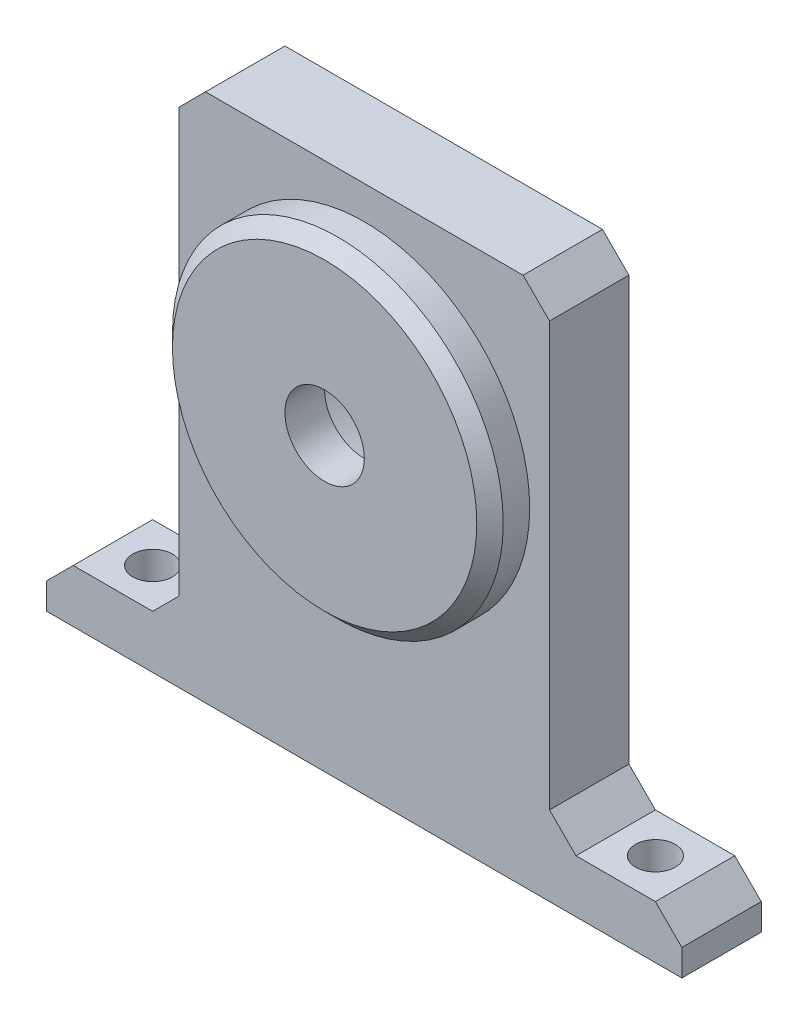
ISO-10303-21;
HEADER;
FILE_DESCRIPTION(('STEP AP214'),'2;1');
FILE_NAME('part.step','',(''),(''),'','','');
FILE_SCHEMA(('AUTOMOTIVE_DESIGN { 1 0 10303 214 1 1 1 1 }'));
ENDSEC;
DATA;
#1=APPLICATION_CONTEXT('core data for automotive mechanical design processes');
#2=APPLICATION_PROTOCOL_DEFINITION('international standard','automotive_design',2000,#1);
#3=PRODUCT_CONTEXT('',#1,'mechanical');
#4=PRODUCT('Part','Part','',(#3));
#5=PRODUCT_RELATED_PRODUCT_CATEGORY('part','',(#4));
#6=PRODUCT_DEFINITION_FORMATION('','',#4);
#7=PRODUCT_DEFINITION_CONTEXT('part definition',#1,'design');
#8=PRODUCT_DEFINITION('design','',#6,#7);
#9=PRODUCT_DEFINITION_SHAPE('','',#8);
#10=(LENGTH_UNIT() NAMED_UNIT(*) SI_UNIT(.MILLI.,.METRE.));
#11=(NAMED_UNIT(*) PLANE_ANGLE_UNIT() SI_UNIT($,.RADIAN.));
#12=(NAMED_UNIT(*) SI_UNIT($,.STERADIAN.) SOLID_ANGLE_UNIT());
#13=UNCERTAINTY_MEASURE_WITH_UNIT(LENGTH_MEASURE(1.E-05),#10,'distance_accuracy_value','');
#14=(GEOMETRIC_REPRESENTATION_CONTEXT(3) GLOBAL_UNCERTAINTY_ASSIGNED_CONTEXT((#13)) GLOBAL_UNIT_ASSIGNED_CONTEXT((#10,
#11,#12)) REPRESENTATION_CONTEXT('',''));
#15=CARTESIAN_POINT('',(0.,0.,0.));
#16=DIRECTION('',(0.,0.,1.));
#17=DIRECTION('',(1.,0.,0.));
#18=AXIS2_PLACEMENT_3D('',#15,#16,#17);
#19=CARTESIAN_POINT('',(0.,0.,6.));
#20=DIRECTION('',(1.,0.,0.));
#21=DIRECTION('',(0.,0.,-1.));
#22=AXIS2_PLACEMENT_3D('',#19,#20,#21);
#23=PLANE('',#22);
#24=DIRECTION('',(0.,-1.,0.));
#25=VECTOR('',#24,1.);
#26=CARTESIAN_POINT('',(0.,0.,0.));
#27=LINE('',#26,#25);
#28=CARTESIAN_POINT('',(0.,38.,0.));
#29=VERTEX_POINT('',#28);
#30=CARTESIAN_POINT('',(0.,5.99999999999999,0.));
#31=VERTEX_POINT('',#30);
#32=EDGE_CURVE('E177',#29,#31,#27,.T.);
#33=ORIENTED_EDGE('',*,*,#32,.T.);
#34=DIRECTION('',(0.,0.,1.));
#35=VECTOR('',#34,1.);
#36=CARTESIAN_POINT('',(0.,5.99999999999999,6.));
#37=LINE('',#36,#35);
#38=CARTESIAN_POINT('',(0.,5.99999999999999,6.));
#39=VERTEX_POINT('',#38);
#40=EDGE_CURVE('E296',#31,#39,#37,.T.);
#41=ORIENTED_EDGE('',*,*,#40,.T.);
#42=DIRECTION('',(0.,-1.,0.));
#43=VECTOR('',#42,1.);
#44=CARTESIAN_POINT('',(0.,0.,6.));
#45=LINE('',#44,#43);
#46=CARTESIAN_POINT('',(0.,38.,6.));
#47=VERTEX_POINT('',#46);
#48=EDGE_CURVE('E222',#47,#39,#45,.T.);
#49=ORIENTED_EDGE('',*,*,#48,.F.);
#50=DIRECTION('',(0.,0.,-1.));
#51=VECTOR('',#50,1.);
#52=CARTESIAN_POINT('',(0.,38.,6.));
#53=LINE('',#52,#51);
#54=EDGE_CURVE('E295',#47,#29,#53,.T.);
#55=ORIENTED_EDGE('',*,*,#54,.T.);
#56=EDGE_LOOP('',(#33,#41,#49,#55));
#57=FACE_BOUND('',#56,.T.);
#58=ADVANCED_FACE('F50',(#57),#23,.F.);
#59=CARTESIAN_POINT('',(28.,0.,6.));
#60=DIRECTION('',(-1.,0.,0.));
#61=DIRECTION('',(0.,0.,1.));
#62=AXIS2_PLACEMENT_3D('',#59,#60,#61);
#63=PLANE('',#62);
#64=DIRECTION('',(0.,1.,0.));
#65=VECTOR('',#64,1.);
#66=CARTESIAN_POINT('',(28.,0.,6.));
#67=LINE('',#66,#65);
#68=CARTESIAN_POINT('',(28.,5.99999999999999,6.));
#69=VERTEX_POINT('',#68);
#70=CARTESIAN_POINT('',(28.,38.,6.));
#71=VERTEX_POINT('',#70);
#72=EDGE_CURVE('E227',#69,#71,#67,.T.);
#73=ORIENTED_EDGE('',*,*,#72,.F.);
#74=DIRECTION('',(0.,0.,-1.));
#75=VECTOR('',#74,1.);
#76=CARTESIAN_POINT('',(28.,5.99999999999999,6.));
#77=LINE('',#76,#75);
#78=CARTESIAN_POINT('',(28.,5.99999999999999,0.));
#79=VERTEX_POINT('',#78);
#80=EDGE_CURVE('E251',#69,#79,#77,.T.);
#81=ORIENTED_EDGE('',*,*,#80,.T.);
#82=DIRECTION('',(0.,1.,0.));
#83=VECTOR('',#82,1.);
#84=CARTESIAN_POINT('',(28.,0.,0.));
#85=LINE('',#84,#83);
#86=CARTESIAN_POINT('',(28.,38.,0.));
#87=VERTEX_POINT('',#86);
#88=EDGE_CURVE('E179',#79,#87,#85,.T.);
#89=ORIENTED_EDGE('',*,*,#88,.T.);
#90=DIRECTION('',(0.,0.,1.));
#91=VECTOR('',#90,1.);
#92=CARTESIAN_POINT('',(28.,38.,6.));
#93=LINE('',#92,#91);
#94=EDGE_CURVE('E246',#87,#71,#93,.T.);
#95=ORIENTED_EDGE('',*,*,#94,.T.);
#96=EDGE_LOOP('',(#73,#81,#89,#95));
#97=FACE_BOUND('',#96,.T.);
#98=ADVANCED_FACE('F367',(#97),#63,.F.);
#99=CARTESIAN_POINT('',(0.,0.,6.));
#100=DIRECTION('',(0.,0.,-1.));
#101=DIRECTION('',(-1.,0.,0.));
#102=AXIS2_PLACEMENT_3D('',#99,#100,#101);
#103=PLANE('',#102);
#104=CARTESIAN_POINT('',(14.,25.,6.));
#105=DIRECTION('',(0.,0.,1.));
#106=DIRECTION('',(1.,0.,0.));
#107=AXIS2_PLACEMENT_3D('',#104,#105,#106);
#108=CIRCLE('',#107,12.5);
#109=CARTESIAN_POINT('',(26.5,25.,6.));
#110=VERTEX_POINT('',#109);
#111=EDGE_CURVE('E316',#110,#110,#108,.T.);
#112=ORIENTED_EDGE('',*,*,#111,.F.);
#113=EDGE_LOOP('',(#112));
#114=FACE_BOUND('',#113,.T.);
#115=DIRECTION('',(0.,-1.,0.));
#116=VECTOR('',#115,1.);
#117=CARTESIAN_POINT('',(38.,4.,6.));
#118=LINE('',#117,#116);
#119=CARTESIAN_POINT('',(38.,1.99999999999999,6.));
#120=VERTEX_POINT('',#119);
#121=CARTESIAN_POINT('',(38.,0.,6.));
#122=VERTEX_POINT('',#121);
#123=EDGE_CURVE('E200',#120,#122,#118,.T.);
#124=ORIENTED_EDGE('',*,*,#123,.F.);
#125=DIRECTION('',(-0.707106781186546,0.707106781186549,0.));
#126=VECTOR('',#125,1.);
#127=CARTESIAN_POINT('',(36.,4.,6.));
#128=LINE('',#127,#126);
#129=CARTESIAN_POINT('',(36.,4.,6.));
#130=VERTEX_POINT('',#129);
#131=EDGE_CURVE('E276',#120,#130,#128,.T.);
#132=ORIENTED_EDGE('',*,*,#131,.T.);
#133=DIRECTION('',(1.,0.,0.));
#134=VECTOR('',#133,1.);
#135=CARTESIAN_POINT('',(28.,4.,6.));
#136=LINE('',#135,#134);
#137=CARTESIAN_POINT('',(30.,4.,6.));
#138=VERTEX_POINT('',#137);
#139=EDGE_CURVE('E192',#138,#130,#136,.T.);
#140=ORIENTED_EDGE('',*,*,#139,.F.);
#141=DIRECTION('',(-0.707106781186552,0.707106781186543,0.));
#142=VECTOR('',#141,1.);
#143=CARTESIAN_POINT('',(16.9999999999998,17.,6.));
#144=LINE('',#143,#142);
#145=EDGE_CURVE('E301',#138,#69,#144,.T.);
#146=ORIENTED_EDGE('',*,*,#145,.T.);
#147=ORIENTED_EDGE('',*,*,#72,.T.);
#148=DIRECTION('',(0.707106781186546,-0.707106781186549,0.));
#149=VECTOR('',#148,1.);
#150=CARTESIAN_POINT('',(26.,40.,6.));
#151=LINE('',#150,#149);
#152=CARTESIAN_POINT('',(26.,40.,6.));
#153=VERTEX_POINT('',#152);
#154=EDGE_CURVE('E72',#71,#153,#151,.F.);
#155=ORIENTED_EDGE('',*,*,#154,.T.);
#156=DIRECTION('',(-1.,0.,0.));
#157=VECTOR('',#156,1.);
#158=CARTESIAN_POINT('',(0.,40.,6.));
#159=LINE('',#158,#157);
#160=CARTESIAN_POINT('',(2.00000000000001,40.,6.));
#161=VERTEX_POINT('',#160);
#162=EDGE_CURVE('E233',#153,#161,#159,.T.);
#163=ORIENTED_EDGE('',*,*,#162,.T.);
#164=DIRECTION('',(0.707106781186549,0.707106781186546,0.));
#165=VECTOR('',#164,1.);
#166=CARTESIAN_POINT('',(0.,38.,6.));
#167=LINE('',#166,#165);
#168=EDGE_CURVE('E272',#161,#47,#167,.F.);
#169=ORIENTED_EDGE('',*,*,#168,.T.);
#170=ORIENTED_EDGE('',*,*,#48,.T.);
#171=DIRECTION('',(0.707106781186552,0.707106781186543,0.));
#172=VECTOR('',#171,1.);
#173=CARTESIAN_POINT('',(-2.99999999999999,3.00000000000004,6.));
#174=LINE('',#173,#172);
#175=CARTESIAN_POINT('',(-2.00000000000002,4.,6.));
#176=VERTEX_POINT('',#175);
#177=EDGE_CURVE('E314',#39,#176,#174,.F.);
#178=ORIENTED_EDGE('',*,*,#177,.T.);
#179=DIRECTION('',(1.,0.,0.));
#180=VECTOR('',#179,1.);
#181=CARTESIAN_POINT('',(0.,4.,6.));
#182=LINE('',#181,#180);
#183=CARTESIAN_POINT('',(-8.00000000000001,4.,6.));
#184=VERTEX_POINT('',#183);
#185=EDGE_CURVE('E193',#184,#176,#182,.T.);
#186=ORIENTED_EDGE('',*,*,#185,.F.);
#187=DIRECTION('',(0.707106781186546,0.707106781186549,0.));
#188=VECTOR('',#187,1.);
#189=CARTESIAN_POINT('',(-8.00000000000001,4.,6.));
#190=LINE('',#189,#188);
#191=CARTESIAN_POINT('',(-10.,2.,6.));
#192=VERTEX_POINT('',#191);
#193=EDGE_CURVE('E277',#184,#192,#190,.F.);
#194=ORIENTED_EDGE('',*,*,#193,.T.);
#195=DIRECTION('',(0.,-1.,0.));
#196=VECTOR('',#195,1.);
#197=CARTESIAN_POINT('',(-10.,4.,6.));
#198=LINE('',#197,#196);
#199=CARTESIAN_POINT('',(-10.,0.,6.));
#200=VERTEX_POINT('',#199);
#201=EDGE_CURVE('E163',#192,#200,#198,.T.);
#202=ORIENTED_EDGE('',*,*,#201,.T.);
#203=DIRECTION('',(1.,0.,0.));
#204=VECTOR('',#203,1.);
#205=CARTESIAN_POINT('',(0.,0.,6.));
#206=LINE('',#205,#204);
#207=EDGE_CURVE('E181',#200,#122,#206,.T.);
#208=ORIENTED_EDGE('',*,*,#207,.T.);
#209=EDGE_LOOP('',(#124,#132,#140,#146,#147,#155,#163,#169,#170,#178,#186,#194,#202,#208));
#210=FACE_BOUND('',#209,.T.);
#211=ADVANCED_FACE('F366',(#114,#210),#103,.F.);
#212=CARTESIAN_POINT('',(0.,0.,0.));
#213=DIRECTION('',(0.,0.,-1.));
#214=DIRECTION('',(-1.,0.,0.));
#215=AXIS2_PLACEMENT_3D('',#212,#213,#214);
#216=PLANE('',#215);
#217=DIRECTION('',(-1.,0.,0.));
#218=VECTOR('',#217,1.);
#219=CARTESIAN_POINT('',(28.,4.,0.));
#220=LINE('',#219,#218);
#221=CARTESIAN_POINT('',(36.,4.,0.));
#222=VERTEX_POINT('',#221);
#223=CARTESIAN_POINT('',(30.,4.,0.));
#224=VERTEX_POINT('',#223);
#225=EDGE_CURVE('E204',#222,#224,#220,.T.);
#226=ORIENTED_EDGE('',*,*,#225,.F.);
#227=DIRECTION('',(0.707106781186546,-0.707106781186549,0.));
#228=VECTOR('',#227,1.);
#229=CARTESIAN_POINT('',(20.0000000000001,20.,0.));
#230=LINE('',#229,#228);
#231=CARTESIAN_POINT('',(38.,1.99999999999999,0.));
#232=VERTEX_POINT('',#231);
#233=EDGE_CURVE('E264',#222,#232,#230,.T.);
#234=ORIENTED_EDGE('',*,*,#233,.T.);
#235=DIRECTION('',(0.,-1.,0.));
#236=VECTOR('',#235,1.);
#237=CARTESIAN_POINT('',(38.,4.,0.));
#238=LINE('',#237,#236);
#239=CARTESIAN_POINT('',(38.,0.,0.));
#240=VERTEX_POINT('',#239);
#241=EDGE_CURVE('E175',#232,#240,#238,.T.);
#242=ORIENTED_EDGE('',*,*,#241,.T.);
#243=DIRECTION('',(1.,0.,0.));
#244=VECTOR('',#243,1.);
#245=CARTESIAN_POINT('',(0.,0.,0.));
#246=LINE('',#245,#244);
#247=CARTESIAN_POINT('',(-10.,0.,0.));
#248=VERTEX_POINT('',#247);
#249=EDGE_CURVE('E170',#248,#240,#246,.T.);
#250=ORIENTED_EDGE('',*,*,#249,.F.);
#251=DIRECTION('',(0.,-1.,0.));
#252=VECTOR('',#251,1.);
#253=CARTESIAN_POINT('',(-10.,4.,0.));
#254=LINE('',#253,#252);
#255=CARTESIAN_POINT('',(-10.,2.,0.));
#256=VERTEX_POINT('',#255);
#257=EDGE_CURVE('E155',#256,#248,#254,.T.);
#258=ORIENTED_EDGE('',*,*,#257,.F.);
#259=DIRECTION('',(-0.707106781186546,-0.707106781186549,0.));
#260=VECTOR('',#259,1.);
#261=CARTESIAN_POINT('',(-6.00000000000002,5.99999999999999,0.));
#262=LINE('',#261,#260);
#263=CARTESIAN_POINT('',(-8.,4.,0.));
#264=VERTEX_POINT('',#263);
#265=EDGE_CURVE('E265',#256,#264,#262,.F.);
#266=ORIENTED_EDGE('',*,*,#265,.T.);
#267=DIRECTION('',(-1.,0.,0.));
#268=VECTOR('',#267,1.);
#269=CARTESIAN_POINT('',(0.,4.,0.));
#270=LINE('',#269,#268);
#271=CARTESIAN_POINT('',(-2.00000000000002,4.,0.));
#272=VERTEX_POINT('',#271);
#273=EDGE_CURVE('E183',#272,#264,#270,.T.);
#274=ORIENTED_EDGE('',*,*,#273,.F.);
#275=DIRECTION('',(-0.707106781186552,-0.707106781186543,0.));
#276=VECTOR('',#275,1.);
#277=CARTESIAN_POINT('',(-2.00000000000002,4.,0.));
#278=LINE('',#277,#276);
#279=EDGE_CURVE('E313',#272,#31,#278,.F.);
#280=ORIENTED_EDGE('',*,*,#279,.T.);
#281=ORIENTED_EDGE('',*,*,#32,.F.);
#282=DIRECTION('',(-0.707106781186549,-0.707106781186546,0.));
#283=VECTOR('',#282,1.);
#284=CARTESIAN_POINT('',(-19.,19.0000000000001,0.));
#285=LINE('',#284,#283);
#286=CARTESIAN_POINT('',(2.00000000000001,40.,0.));
#287=VERTEX_POINT('',#286);
#288=EDGE_CURVE('E259',#29,#287,#285,.F.);
#289=ORIENTED_EDGE('',*,*,#288,.T.);
#290=DIRECTION('',(-1.,0.,0.));
#291=VECTOR('',#290,1.);
#292=CARTESIAN_POINT('',(0.,40.,0.));
#293=LINE('',#292,#291);
#294=CARTESIAN_POINT('',(26.,40.,0.));
#295=VERTEX_POINT('',#294);
#296=EDGE_CURVE('E223',#295,#287,#293,.T.);
#297=ORIENTED_EDGE('',*,*,#296,.F.);
#298=DIRECTION('',(-0.707106781186546,0.707106781186549,0.));
#299=VECTOR('',#298,1.);
#300=CARTESIAN_POINT('',(33.,32.9999999999999,0.));
#301=LINE('',#300,#299);
#302=EDGE_CURVE('E258',#295,#87,#301,.F.);
#303=ORIENTED_EDGE('',*,*,#302,.T.);
#304=ORIENTED_EDGE('',*,*,#88,.F.);
#305=DIRECTION('',(0.707106781186552,-0.707106781186543,0.));
#306=VECTOR('',#305,1.);
#307=CARTESIAN_POINT('',(30.,4.,0.));
#308=LINE('',#307,#306);
#309=EDGE_CURVE('E306',#79,#224,#308,.T.);
#310=ORIENTED_EDGE('',*,*,#309,.T.);
#311=EDGE_LOOP('',(#226,#234,#242,#250,#258,#266,#274,#280,#281,#289,#297,#303,#304,#310));
#312=FACE_BOUND('',#311,.T.);
#313=CARTESIAN_POINT('',(14.,25.,0.));
#314=DIRECTION('',(0.,0.,1.));
#315=DIRECTION('',(1.,0.,0.));
#316=AXIS2_PLACEMENT_3D('',#313,#314,#315);
#317=CIRCLE('',#316,9.5);
#318=CARTESIAN_POINT('',(23.5,25.,0.));
#319=VERTEX_POINT('',#318);
#320=EDGE_CURVE('E162',#319,#319,#317,.T.);
#321=ORIENTED_EDGE('',*,*,#320,.T.);
#322=EDGE_LOOP('',(#321));
#323=FACE_BOUND('',#322,.T.);
#324=ADVANCED_FACE('F166',(#312,#323),#216,.T.);
#325=CARTESIAN_POINT('',(0.,0.,6.));
#326=DIRECTION('',(0.,1.,0.));
#327=DIRECTION('',(0.,0.,1.));
#328=AXIS2_PLACEMENT_3D('',#325,#326,#327);
#329=PLANE('',#328);
#330=CARTESIAN_POINT('',(-5.00000000000001,0.,3.00000000000001));
#331=DIRECTION('',(0.,1.,0.));
#332=DIRECTION('',(0.,0.,1.));
#333=AXIS2_PLACEMENT_3D('',#330,#331,#332);
#334=CIRCLE('',#333,1.5);
#335=CARTESIAN_POINT('',(-5.00000000000001,0.,4.50000000000001));
#336=VERTEX_POINT('',#335);
#337=EDGE_CURVE('E205',#336,#336,#334,.T.);
#338=ORIENTED_EDGE('',*,*,#337,.T.);
#339=EDGE_LOOP('',(#338));
#340=FACE_BOUND('',#339,.T.);
#341=CARTESIAN_POINT('',(33.,0.,3.00000000000001));
#342=DIRECTION('',(0.,1.,0.));
#343=DIRECTION('',(0.,0.,1.));
#344=AXIS2_PLACEMENT_3D('',#341,#342,#343);
#345=CIRCLE('',#344,1.5);
#346=CARTESIAN_POINT('',(33.,0.,4.50000000000001));
#347=VERTEX_POINT('',#346);
#348=EDGE_CURVE('E216',#347,#347,#345,.T.);
#349=ORIENTED_EDGE('',*,*,#348,.T.);
#350=EDGE_LOOP('',(#349));
#351=FACE_BOUND('',#350,.T.);
#352=ORIENTED_EDGE('',*,*,#249,.T.);
#353=DIRECTION('',(0.,0.,-1.));
#354=VECTOR('',#353,1.);
#355=CARTESIAN_POINT('',(38.,0.,0.));
#356=LINE('',#355,#354);
#357=EDGE_CURVE('E186',#122,#240,#356,.T.);
#358=ORIENTED_EDGE('',*,*,#357,.F.);
#359=ORIENTED_EDGE('',*,*,#207,.F.);
#360=DIRECTION('',(0.,0.,1.));
#361=VECTOR('',#360,1.);
#362=CARTESIAN_POINT('',(-10.,0.,0.));
#363=LINE('',#362,#361);
#364=EDGE_CURVE('E160',#248,#200,#363,.T.);
#365=ORIENTED_EDGE('',*,*,#364,.F.);
#366=EDGE_LOOP('',(#352,#358,#359,#365));
#367=FACE_BOUND('',#366,.T.);
#368=ADVANCED_FACE('F182',(#340,#351,#367),#329,.F.);
#369=CARTESIAN_POINT('',(0.,40.,6.));
#370=DIRECTION('',(0.,-1.,0.));
#371=DIRECTION('',(0.,0.,-1.));
#372=AXIS2_PLACEMENT_3D('',#369,#370,#371);
#373=PLANE('',#372);
#374=ORIENTED_EDGE('',*,*,#296,.T.);
#375=DIRECTION('',(0.,0.,1.));
#376=VECTOR('',#375,1.);
#377=CARTESIAN_POINT('',(2.00000000000001,40.,6.));
#378=LINE('',#377,#376);
#379=EDGE_CURVE('E63',#287,#161,#378,.T.);
#380=ORIENTED_EDGE('',*,*,#379,.T.);
#381=ORIENTED_EDGE('',*,*,#162,.F.);
#382=DIRECTION('',(0.,0.,-1.));
#383=VECTOR('',#382,1.);
#384=CARTESIAN_POINT('',(26.,40.,6.));
#385=LINE('',#384,#383);
#386=EDGE_CURVE('E298',#153,#295,#385,.T.);
#387=ORIENTED_EDGE('',*,*,#386,.T.);
#388=EDGE_LOOP('',(#374,#380,#381,#387));
#389=FACE_BOUND('',#388,.T.);
#390=ADVANCED_FACE('F380',(#389),#373,.F.);
#391=CARTESIAN_POINT('',(14.,25.,6.));
#392=DIRECTION('',(0.,0.,-1.));
#393=DIRECTION('',(-1.,0.,0.));
#394=AXIS2_PLACEMENT_3D('',#391,#392,#393);
#395=CYLINDRICAL_SURFACE('',#394,9.5);
#396=CARTESIAN_POINT('',(14.,25.,6.));
#397=DIRECTION('',(0.,0.,1.));
#398=DIRECTION('',(1.,0.,0.));
#399=AXIS2_PLACEMENT_3D('',#396,#397,#398);
#400=CIRCLE('',#399,9.5);
#401=CARTESIAN_POINT('',(23.5,25.,6.));
#402=VERTEX_POINT('',#401);
#403=EDGE_CURVE('E215',#402,#402,#400,.T.);
#404=ORIENTED_EDGE('',*,*,#403,.T.);
#405=EDGE_LOOP('',(#404));
#406=FACE_BOUND('',#405,.T.);
#407=ORIENTED_EDGE('',*,*,#320,.F.);
#408=EDGE_LOOP('',(#407));
#409=FACE_BOUND('',#408,.T.);
#410=ADVANCED_FACE('F502',(#406,#409),#395,.F.);
#411=CARTESIAN_POINT('',(38.,4.,0.));
#412=DIRECTION('',(-1.,0.,0.));
#413=DIRECTION('',(0.,0.,1.));
#414=AXIS2_PLACEMENT_3D('',#411,#412,#413);
#415=PLANE('',#414);
#416=ORIENTED_EDGE('',*,*,#241,.F.);
#417=DIRECTION('',(0.,0.,1.));
#418=VECTOR('',#417,1.);
#419=CARTESIAN_POINT('',(38.,1.99999999999999,6.));
#420=LINE('',#419,#418);
#421=EDGE_CURVE('E268',#232,#120,#420,.T.);
#422=ORIENTED_EDGE('',*,*,#421,.T.);
#423=ORIENTED_EDGE('',*,*,#123,.T.);
#424=ORIENTED_EDGE('',*,*,#357,.T.);
#425=EDGE_LOOP('',(#416,#422,#423,#424));
#426=FACE_BOUND('',#425,.T.);
#427=ADVANCED_FACE('F359',(#426),#415,.F.);
#428=CARTESIAN_POINT('',(0.,4.,0.));
#429=DIRECTION('',(0.,1.,0.));
#430=DIRECTION('',(0.,0.,1.));
#431=AXIS2_PLACEMENT_3D('',#428,#429,#430);
#432=PLANE('',#431);
#433=CARTESIAN_POINT('',(33.,4.,3.00000000000001));
#434=DIRECTION('',(0.,1.,0.));
#435=DIRECTION('',(0.,0.,1.));
#436=AXIS2_PLACEMENT_3D('',#433,#434,#435);
#437=CIRCLE('',#436,1.5);
#438=CARTESIAN_POINT('',(33.,4.,4.50000000000001));
#439=VERTEX_POINT('',#438);
#440=EDGE_CURVE('E340',#439,#439,#437,.T.);
#441=ORIENTED_EDGE('',*,*,#440,.F.);
#442=EDGE_LOOP('',(#441));
#443=FACE_BOUND('',#442,.T.);
#444=ORIENTED_EDGE('',*,*,#225,.T.);
#445=DIRECTION('',(0.,0.,1.));
#446=VECTOR('',#445,1.);
#447=CARTESIAN_POINT('',(30.,4.,0.));
#448=LINE('',#447,#446);
#449=EDGE_CURVE('E248',#224,#138,#448,.T.);
#450=ORIENTED_EDGE('',*,*,#449,.T.);
#451=ORIENTED_EDGE('',*,*,#139,.T.);
#452=DIRECTION('',(0.,0.,-1.));
#453=VECTOR('',#452,1.);
#454=CARTESIAN_POINT('',(36.,4.,0.));
#455=LINE('',#454,#453);
#456=EDGE_CURVE('E235',#130,#222,#455,.T.);
#457=ORIENTED_EDGE('',*,*,#456,.T.);
#458=EDGE_LOOP('',(#444,#450,#451,#457));
#459=FACE_BOUND('',#458,.T.);
#460=ADVANCED_FACE('F353',(#443,#459),#432,.T.);
#461=CARTESIAN_POINT('',(-10.,4.,0.));
#462=DIRECTION('',(1.,0.,0.));
#463=DIRECTION('',(0.,0.,-1.));
#464=AXIS2_PLACEMENT_3D('',#461,#462,#463);
#465=PLANE('',#464);
#466=ORIENTED_EDGE('',*,*,#201,.F.);
#467=DIRECTION('',(0.,0.,-1.));
#468=VECTOR('',#467,1.);
#469=CARTESIAN_POINT('',(-10.,2.,0.));
#470=LINE('',#469,#468);
#471=EDGE_CURVE('E157',#192,#256,#470,.T.);
#472=ORIENTED_EDGE('',*,*,#471,.T.);
#473=ORIENTED_EDGE('',*,*,#257,.T.);
#474=ORIENTED_EDGE('',*,*,#364,.T.);
#475=EDGE_LOOP('',(#466,#472,#473,#474));
#476=FACE_BOUND('',#475,.T.);
#477=ADVANCED_FACE('F154',(#476),#465,.F.);
#478=CARTESIAN_POINT('',(0.,4.,0.));
#479=DIRECTION('',(0.,-1.,0.));
#480=DIRECTION('',(0.,0.,-1.));
#481=AXIS2_PLACEMENT_3D('',#478,#479,#480);
#482=PLANE('',#481);
#483=CARTESIAN_POINT('',(-5.00000000000001,4.,3.00000000000001));
#484=DIRECTION('',(0.,1.,0.));
#485=DIRECTION('',(0.,0.,1.));
#486=AXIS2_PLACEMENT_3D('',#483,#484,#485);
#487=CIRCLE('',#486,1.5);
#488=CARTESIAN_POINT('',(-5.00000000000001,4.,4.50000000000001));
#489=VERTEX_POINT('',#488);
#490=EDGE_CURVE('E334',#489,#489,#487,.T.);
#491=ORIENTED_EDGE('',*,*,#490,.F.);
#492=EDGE_LOOP('',(#491));
#493=FACE_BOUND('',#492,.T.);
#494=ORIENTED_EDGE('',*,*,#273,.T.);
#495=DIRECTION('',(0.,0.,1.));
#496=VECTOR('',#495,1.);
#497=CARTESIAN_POINT('',(-8.,4.,0.));
#498=LINE('',#497,#496);
#499=EDGE_CURVE('E288',#264,#184,#498,.T.);
#500=ORIENTED_EDGE('',*,*,#499,.T.);
#501=ORIENTED_EDGE('',*,*,#185,.T.);
#502=DIRECTION('',(0.,0.,-1.));
#503=VECTOR('',#502,1.);
#504=CARTESIAN_POINT('',(-2.00000000000002,4.,0.));
#505=LINE('',#504,#503);
#506=EDGE_CURVE('E285',#176,#272,#505,.T.);
#507=ORIENTED_EDGE('',*,*,#506,.T.);
#508=EDGE_LOOP('',(#494,#500,#501,#507));
#509=FACE_BOUND('',#508,.T.);
#510=ADVANCED_FACE('F393',(#493,#509),#482,.F.);
#511=CARTESIAN_POINT('',(30.,4.,0.));
#512=DIRECTION('',(-0.707106781186543,-0.707106781186552,0.));
#513=DIRECTION('',(0.,0.,1.));
#514=AXIS2_PLACEMENT_3D('',#511,#512,#513);
#515=PLANE('',#514);
#516=ORIENTED_EDGE('',*,*,#309,.F.);
#517=ORIENTED_EDGE('',*,*,#80,.F.);
#518=ORIENTED_EDGE('',*,*,#145,.F.);
#519=ORIENTED_EDGE('',*,*,#449,.F.);
#520=EDGE_LOOP('',(#516,#517,#518,#519));
#521=FACE_BOUND('',#520,.T.);
#522=ADVANCED_FACE('F365',(#521),#515,.F.);
#523=CARTESIAN_POINT('',(36.,4.,0.));
#524=DIRECTION('',(0.707106781186549,0.707106781186546,0.));
#525=DIRECTION('',(0.,0.,1.));
#526=AXIS2_PLACEMENT_3D('',#523,#524,#525);
#527=PLANE('',#526);
#528=ORIENTED_EDGE('',*,*,#131,.F.);
#529=ORIENTED_EDGE('',*,*,#421,.F.);
#530=ORIENTED_EDGE('',*,*,#233,.F.);
#531=ORIENTED_EDGE('',*,*,#456,.F.);
#532=EDGE_LOOP('',(#528,#529,#530,#531));
#533=FACE_BOUND('',#532,.T.);
#534=ADVANCED_FACE('F401',(#533),#527,.T.);
#535=CARTESIAN_POINT('',(-8.,4.,0.));
#536=DIRECTION('',(0.707106781186549,-0.707106781186546,0.));
#537=DIRECTION('',(0.,0.,1.));
#538=AXIS2_PLACEMENT_3D('',#535,#536,#537);
#539=PLANE('',#538);
#540=ORIENTED_EDGE('',*,*,#265,.F.);
#541=ORIENTED_EDGE('',*,*,#471,.F.);
#542=ORIENTED_EDGE('',*,*,#193,.F.);
#543=ORIENTED_EDGE('',*,*,#499,.F.);
#544=EDGE_LOOP('',(#540,#541,#542,#543));
#545=FACE_BOUND('',#544,.T.);
#546=ADVANCED_FACE('F399',(#545),#539,.F.);
#547=CARTESIAN_POINT('',(-2.00000000000002,4.,0.));
#548=DIRECTION('',(-0.707106781186543,0.707106781186552,0.));
#549=DIRECTION('',(0.,0.,1.));
#550=AXIS2_PLACEMENT_3D('',#547,#548,#549);
#551=PLANE('',#550);
#552=ORIENTED_EDGE('',*,*,#177,.F.);
#553=ORIENTED_EDGE('',*,*,#40,.F.);
#554=ORIENTED_EDGE('',*,*,#279,.F.);
#555=ORIENTED_EDGE('',*,*,#506,.F.);
#556=EDGE_LOOP('',(#552,#553,#554,#555));
#557=FACE_BOUND('',#556,.T.);
#558=ADVANCED_FACE('F391',(#557),#551,.T.);
#559=CARTESIAN_POINT('',(0.,38.,6.));
#560=DIRECTION('',(0.707106781186546,-0.707106781186549,0.));
#561=DIRECTION('',(0.,0.,-1.));
#562=AXIS2_PLACEMENT_3D('',#559,#560,#561);
#563=PLANE('',#562);
#564=ORIENTED_EDGE('',*,*,#168,.F.);
#565=ORIENTED_EDGE('',*,*,#379,.F.);
#566=ORIENTED_EDGE('',*,*,#288,.F.);
#567=ORIENTED_EDGE('',*,*,#54,.F.);
#568=EDGE_LOOP('',(#564,#565,#566,#567));
#569=FACE_BOUND('',#568,.T.);
#570=ADVANCED_FACE('F385',(#569),#563,.F.);
#571=CARTESIAN_POINT('',(26.,40.,6.));
#572=DIRECTION('',(-0.707106781186549,-0.707106781186546,0.));
#573=DIRECTION('',(0.,0.,-1.));
#574=AXIS2_PLACEMENT_3D('',#571,#572,#573);
#575=PLANE('',#574);
#576=ORIENTED_EDGE('',*,*,#154,.F.);
#577=ORIENTED_EDGE('',*,*,#94,.F.);
#578=ORIENTED_EDGE('',*,*,#302,.F.);
#579=ORIENTED_EDGE('',*,*,#386,.F.);
#580=EDGE_LOOP('',(#576,#577,#578,#579));
#581=FACE_BOUND('',#580,.T.);
#582=ADVANCED_FACE('F372',(#581),#575,.F.);
#583=CARTESIAN_POINT('',(-5.00000000000001,0.,3.00000000000001));
#584=DIRECTION('',(0.,1.,0.));
#585=DIRECTION('',(0.,0.,1.));
#586=AXIS2_PLACEMENT_3D('',#583,#584,#585);
#587=CYLINDRICAL_SURFACE('',#586,1.5);
#588=ORIENTED_EDGE('',*,*,#337,.F.);
#589=EDGE_LOOP('',(#588));
#590=FACE_BOUND('',#589,.T.);
#591=ORIENTED_EDGE('',*,*,#490,.T.);
#592=EDGE_LOOP('',(#591));
#593=FACE_BOUND('',#592,.T.);
#594=ADVANCED_FACE('F348',(#590,#593),#587,.F.);
#595=CARTESIAN_POINT('',(33.,0.,3.00000000000001));
#596=DIRECTION('',(0.,1.,0.));
#597=DIRECTION('',(0.,0.,1.));
#598=AXIS2_PLACEMENT_3D('',#595,#596,#597);
#599=CYLINDRICAL_SURFACE('',#598,1.5);
#600=ORIENTED_EDGE('',*,*,#348,.F.);
#601=EDGE_LOOP('',(#600));
#602=FACE_BOUND('',#601,.T.);
#603=ORIENTED_EDGE('',*,*,#440,.T.);
#604=EDGE_LOOP('',(#603));
#605=FACE_BOUND('',#604,.T.);
#606=ADVANCED_FACE('F347',(#602,#605),#599,.F.);
#607=CARTESIAN_POINT('',(14.,25.,9.));
#608=DIRECTION('',(0.,0.,1.));
#609=DIRECTION('',(1.,0.,0.));
#610=AXIS2_PLACEMENT_3D('',#607,#608,#609);
#611=PLANE('',#610);
#612=CARTESIAN_POINT('',(14.,25.,9.));
#613=DIRECTION('',(0.,0.,1.));
#614=DIRECTION('',(1.,0.,0.));
#615=AXIS2_PLACEMENT_3D('',#612,#613,#614);
#616=CIRCLE('',#615,11.5);
#617=CARTESIAN_POINT('',(25.5,25.,9.));
#618=VERTEX_POINT('',#617);
#619=EDGE_CURVE('E60',#618,#618,#616,.T.);
#620=ORIENTED_EDGE('',*,*,#619,.T.);
#621=EDGE_LOOP('',(#620));
#622=FACE_BOUND('',#621,.T.);
#623=CARTESIAN_POINT('',(14.,25.,9.));
#624=DIRECTION('',(0.,0.,1.));
#625=DIRECTION('',(1.,0.,0.));
#626=AXIS2_PLACEMENT_3D('',#623,#624,#625);
#627=CIRCLE('',#626,3.);
#628=CARTESIAN_POINT('',(17.,25.,9.));
#629=VERTEX_POINT('',#628);
#630=EDGE_CURVE('E220',#629,#629,#627,.T.);
#631=ORIENTED_EDGE('',*,*,#630,.F.);
#632=EDGE_LOOP('',(#631));
#633=FACE_BOUND('',#632,.T.);
#634=ADVANCED_FACE('F349',(#622,#633),#611,.T.);
#635=CARTESIAN_POINT('',(14.,25.,6.));
#636=DIRECTION('',(0.,0.,1.));
#637=DIRECTION('',(1.,0.,0.));
#638=AXIS2_PLACEMENT_3D('',#635,#636,#637);
#639=PLANE('',#638);
#640=ORIENTED_EDGE('',*,*,#403,.F.);
#641=EDGE_LOOP('',(#640));
#642=FACE_BOUND('',#641,.T.);
#643=CARTESIAN_POINT('',(14.,25.,6.));
#644=DIRECTION('',(0.,0.,1.));
#645=DIRECTION('',(1.,0.,0.));
#646=AXIS2_PLACEMENT_3D('',#643,#644,#645);
#647=CIRCLE('',#646,3.);
#648=CARTESIAN_POINT('',(17.,25.,6.));
#649=VERTEX_POINT('',#648);
#650=EDGE_CURVE('E327',#649,#649,#647,.T.);
#651=ORIENTED_EDGE('',*,*,#650,.T.);
#652=EDGE_LOOP('',(#651));
#653=FACE_BOUND('',#652,.T.);
#654=ADVANCED_FACE('F571',(#642,#653),#639,.F.);
#655=CARTESIAN_POINT('',(14.,25.,9.));
#656=DIRECTION('',(0.,0.,-1.));
#657=DIRECTION('',(-1.,0.,0.));
#658=AXIS2_PLACEMENT_3D('',#655,#656,#657);
#659=CYLINDRICAL_SURFACE('',#658,12.5);
#660=CARTESIAN_POINT('',(14.,25.,7.99999999999999));
#661=DIRECTION('',(0.,0.,1.));
#662=DIRECTION('',(1.,0.,0.));
#663=AXIS2_PLACEMENT_3D('',#660,#661,#662);
#664=CIRCLE('',#663,12.5);
#665=CARTESIAN_POINT('',(26.5,25.,7.99999999999999));
#666=VERTEX_POINT('',#665);
#667=EDGE_CURVE('E11',#666,#666,#664,.F.);
#668=ORIENTED_EDGE('',*,*,#667,.T.);
#669=EDGE_LOOP('',(#668));
#670=FACE_BOUND('',#669,.T.);
#671=ORIENTED_EDGE('',*,*,#111,.T.);
#672=EDGE_LOOP('',(#671));
#673=FACE_BOUND('',#672,.T.);
#674=ADVANCED_FACE('F574',(#670,#673),#659,.T.);
#675=CARTESIAN_POINT('',(14.,25.,9.));
#676=DIRECTION('',(0.,0.,-1.));
#677=DIRECTION('',(-1.,0.,0.));
#678=AXIS2_PLACEMENT_3D('',#675,#676,#677);
#679=CYLINDRICAL_SURFACE('',#678,3.);
#680=ORIENTED_EDGE('',*,*,#630,.T.);
#681=EDGE_LOOP('',(#680));
#682=FACE_BOUND('',#681,.T.);
#683=ORIENTED_EDGE('',*,*,#650,.F.);
#684=EDGE_LOOP('',(#683));
#685=FACE_BOUND('',#684,.T.);
#686=ADVANCED_FACE('F581',(#682,#685),#679,.F.);
#687=CARTESIAN_POINT('',(14.,25.,9.));
#688=DIRECTION('',(0.,0.,-1.));
#689=DIRECTION('',(-1.,0.,0.));
#690=AXIS2_PLACEMENT_3D('',#687,#688,#689);
#691=CONICAL_SURFACE('',#690,11.5,0.785398163397444);
#692=ORIENTED_EDGE('',*,*,#667,.F.);
#693=EDGE_LOOP('',(#692));
#694=FACE_BOUND('',#693,.T.);
#695=ORIENTED_EDGE('',*,*,#619,.F.);
#696=EDGE_LOOP('',(#695));
#697=FACE_BOUND('',#696,.T.);
#698=ADVANCED_FACE('F49',(#694,#697),#691,.T.);
#699=CLOSED_SHELL('',(#58,#98,#211,#324,#368,#390,#410,#427,#460,#477,#510,#522,#534,#546,#558,
#570,#582,#594,#606,#634,#654,#674,#686,#698));
#700=MANIFOLD_SOLID_BREP('B2',#699);
#701=ADVANCED_BREP_SHAPE_REPRESENTATION('',(#18,#700),#14);
#702=SHAPE_DEFINITION_REPRESENTATION(#9,#701);
ENDSEC;
END-ISO-10303-21;
